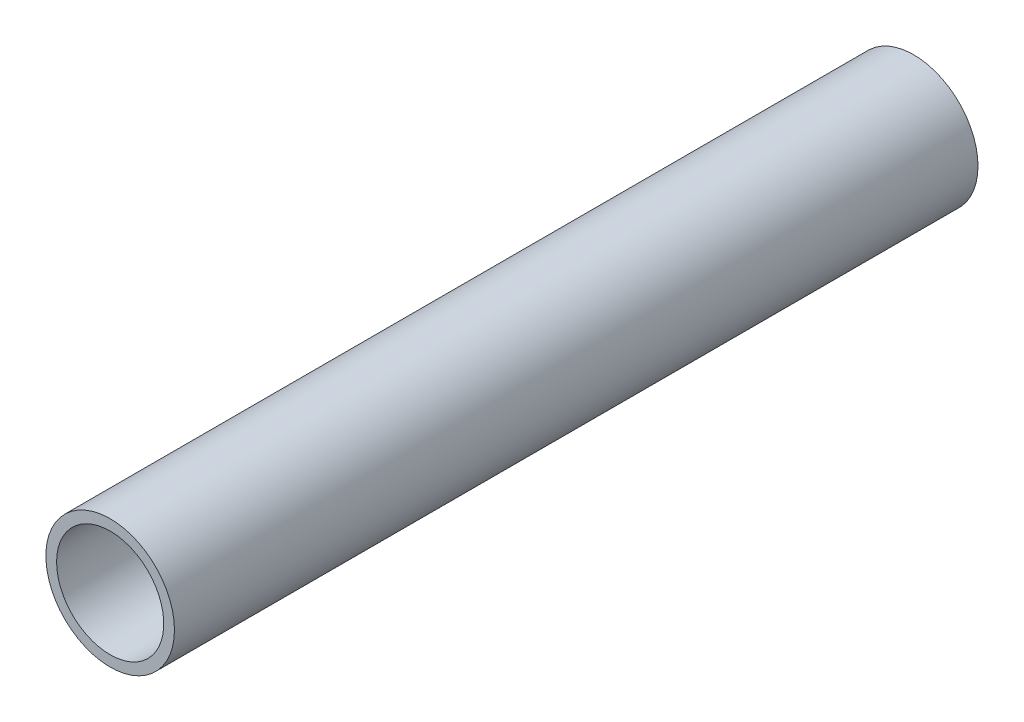
ISO-10303-21;
HEADER;
FILE_DESCRIPTION(('STEP AP214'),'2;1');
FILE_NAME('part.step','',(''),(''),'','','');
FILE_SCHEMA(('AUTOMOTIVE_DESIGN { 1 0 10303 214 1 1 1 1 }'));
ENDSEC;
DATA;
#1=APPLICATION_CONTEXT('core data for automotive mechanical design processes');
#2=APPLICATION_PROTOCOL_DEFINITION('international standard','automotive_design',2000,#1);
#3=PRODUCT_CONTEXT('',#1,'mechanical');
#4=PRODUCT('Part','Part','',(#3));
#5=PRODUCT_RELATED_PRODUCT_CATEGORY('part','',(#4));
#6=PRODUCT_DEFINITION_FORMATION('','',#4);
#7=PRODUCT_DEFINITION_CONTEXT('part definition',#1,'design');
#8=PRODUCT_DEFINITION('design','',#6,#7);
#9=PRODUCT_DEFINITION_SHAPE('','',#8);
#10=(LENGTH_UNIT() NAMED_UNIT(*) SI_UNIT(.MILLI.,.METRE.));
#11=(NAMED_UNIT(*) PLANE_ANGLE_UNIT() SI_UNIT($,.RADIAN.));
#12=(NAMED_UNIT(*) SI_UNIT($,.STERADIAN.) SOLID_ANGLE_UNIT());
#13=UNCERTAINTY_MEASURE_WITH_UNIT(LENGTH_MEASURE(1.E-05),#10,'distance_accuracy_value','');
#14=(GEOMETRIC_REPRESENTATION_CONTEXT(3) GLOBAL_UNCERTAINTY_ASSIGNED_CONTEXT((#13)) GLOBAL_UNIT_ASSIGNED_CONTEXT((#10,
#11,#12)) REPRESENTATION_CONTEXT('',''));
#15=CARTESIAN_POINT('',(0.,0.,0.));
#16=DIRECTION('',(0.,0.,1.));
#17=DIRECTION('',(1.,0.,0.));
#18=AXIS2_PLACEMENT_3D('',#15,#16,#17);
#19=CARTESIAN_POINT('',(0.,0.,150.));
#20=DIRECTION('',(0.,0.,-1.));
#21=DIRECTION('',(-1.,0.,0.));
#22=AXIS2_PLACEMENT_3D('',#19,#20,#21);
#23=CYLINDRICAL_SURFACE('',#22,12.);
#24=CARTESIAN_POINT('',(0.,0.,150.));
#25=DIRECTION('',(0.,0.,1.));
#26=DIRECTION('',(1.,0.,0.));
#27=AXIS2_PLACEMENT_3D('',#24,#25,#26);
#28=CIRCLE('',#27,12.);
#29=CARTESIAN_POINT('',(12.,0.,150.));
#30=VERTEX_POINT('',#29);
#31=EDGE_CURVE('E10',#30,#30,#28,.T.);
#32=ORIENTED_EDGE('',*,*,#31,.F.);
#33=EDGE_LOOP('',(#32));
#34=FACE_BOUND('',#33,.T.);
#35=CARTESIAN_POINT('',(0.,0.,0.));
#36=DIRECTION('',(0.,0.,1.));
#37=DIRECTION('',(1.,0.,0.));
#38=AXIS2_PLACEMENT_3D('',#35,#36,#37);
#39=CIRCLE('',#38,12.);
#40=CARTESIAN_POINT('',(12.,0.,0.));
#41=VERTEX_POINT('',#40);
#42=EDGE_CURVE('E42',#41,#41,#39,.T.);
#43=ORIENTED_EDGE('',*,*,#42,.T.);
#44=EDGE_LOOP('',(#43));
#45=FACE_BOUND('',#44,.T.);
#46=ADVANCED_FACE('F39',(#34,#45),#23,.T.);
#47=CARTESIAN_POINT('',(0.,0.,150.));
#48=DIRECTION('',(0.,0.,1.));
#49=DIRECTION('',(1.,0.,0.));
#50=AXIS2_PLACEMENT_3D('',#47,#48,#49);
#51=PLANE('',#50);
#52=CARTESIAN_POINT('',(0.,0.,150.));
#53=DIRECTION('',(0.,0.,-1.));
#54=DIRECTION('',(-1.,0.,0.));
#55=AXIS2_PLACEMENT_3D('',#52,#53,#54);
#56=CIRCLE('',#55,10.);
#57=CARTESIAN_POINT('',(-10.,0.,150.));
#58=VERTEX_POINT('',#57);
#59=EDGE_CURVE('E51',#58,#58,#56,.T.);
#60=ORIENTED_EDGE('',*,*,#59,.T.);
#61=EDGE_LOOP('',(#60));
#62=FACE_BOUND('',#61,.T.);
#63=ORIENTED_EDGE('',*,*,#31,.T.);
#64=EDGE_LOOP('',(#63));
#65=FACE_BOUND('',#64,.T.);
#66=ADVANCED_FACE('F61',(#62,#65),#51,.T.);
#67=CARTESIAN_POINT('',(0.,0.,0.));
#68=DIRECTION('',(0.,0.,1.));
#69=DIRECTION('',(1.,0.,0.));
#70=AXIS2_PLACEMENT_3D('',#67,#68,#69);
#71=PLANE('',#70);
#72=CARTESIAN_POINT('',(0.,0.,0.));
#73=DIRECTION('',(0.,0.,-1.));
#74=DIRECTION('',(-1.,0.,0.));
#75=AXIS2_PLACEMENT_3D('',#72,#73,#74);
#76=CIRCLE('',#75,10.);
#77=CARTESIAN_POINT('',(-10.,0.,0.));
#78=VERTEX_POINT('',#77);
#79=EDGE_CURVE('E53',#78,#78,#76,.T.);
#80=ORIENTED_EDGE('',*,*,#79,.F.);
#81=EDGE_LOOP('',(#80));
#82=FACE_BOUND('',#81,.T.);
#83=ORIENTED_EDGE('',*,*,#42,.F.);
#84=EDGE_LOOP('',(#83));
#85=FACE_BOUND('',#84,.T.);
#86=ADVANCED_FACE('F66',(#82,#85),#71,.F.);
#87=CARTESIAN_POINT('',(0.,0.,150.));
#88=DIRECTION('',(0.,0.,-1.));
#89=DIRECTION('',(-1.,0.,0.));
#90=AXIS2_PLACEMENT_3D('',#87,#88,#89);
#91=CYLINDRICAL_SURFACE('',#90,10.);
#92=ORIENTED_EDGE('',*,*,#59,.F.);
#93=EDGE_LOOP('',(#92));
#94=FACE_BOUND('',#93,.T.);
#95=ORIENTED_EDGE('',*,*,#79,.T.);
#96=EDGE_LOOP('',(#95));
#97=FACE_BOUND('',#96,.T.);
#98=ADVANCED_FACE('F63',(#94,#97),#91,.F.);
#99=CLOSED_SHELL('',(#46,#66,#86,#98));
#100=MANIFOLD_SOLID_BREP('B2',#99);
#101=ADVANCED_BREP_SHAPE_REPRESENTATION('',(#18,#100),#14);
#102=SHAPE_DEFINITION_REPRESENTATION(#9,#101);
ENDSEC;
END-ISO-10303-21;
